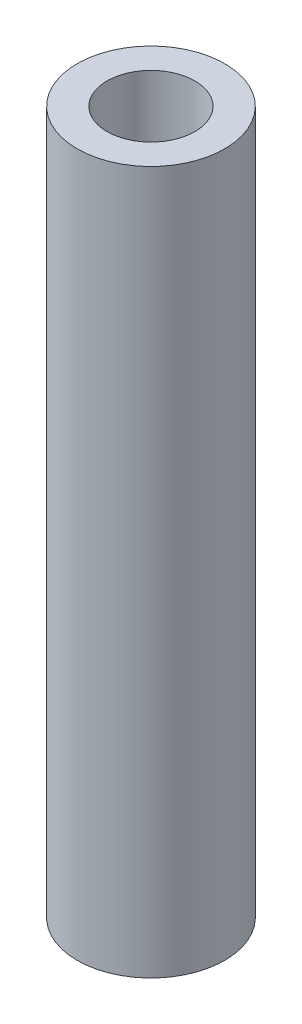
ISO-10303-21;
HEADER;
FILE_DESCRIPTION(('STEP AP214'),'2;1');
FILE_NAME('part.step','',(''),(''),'','','');
FILE_SCHEMA(('AUTOMOTIVE_DESIGN { 1 0 10303 214 1 1 1 1 }'));
ENDSEC;
DATA;
#1=APPLICATION_CONTEXT('core data for automotive mechanical design processes');
#2=APPLICATION_PROTOCOL_DEFINITION('international standard','automotive_design',2000,#1);
#3=PRODUCT_CONTEXT('',#1,'mechanical');
#4=PRODUCT('Part','Part','',(#3));
#5=PRODUCT_RELATED_PRODUCT_CATEGORY('part','',(#4));
#6=PRODUCT_DEFINITION_FORMATION('','',#4);
#7=PRODUCT_DEFINITION_CONTEXT('part definition',#1,'design');
#8=PRODUCT_DEFINITION('design','',#6,#7);
#9=PRODUCT_DEFINITION_SHAPE('','',#8);
#10=(LENGTH_UNIT() NAMED_UNIT(*) SI_UNIT(.MILLI.,.METRE.));
#11=(NAMED_UNIT(*) PLANE_ANGLE_UNIT() SI_UNIT($,.RADIAN.));
#12=(NAMED_UNIT(*) SI_UNIT($,.STERADIAN.) SOLID_ANGLE_UNIT());
#13=UNCERTAINTY_MEASURE_WITH_UNIT(LENGTH_MEASURE(1.E-05),#10,'distance_accuracy_value','');
#14=(GEOMETRIC_REPRESENTATION_CONTEXT(3) GLOBAL_UNCERTAINTY_ASSIGNED_CONTEXT((#13)) GLOBAL_UNIT_ASSIGNED_CONTEXT((#10,
#11,#12)) REPRESENTATION_CONTEXT('',''));
#15=CARTESIAN_POINT('',(0.,0.,0.));
#16=DIRECTION('',(0.,0.,1.));
#17=DIRECTION('',(1.,0.,0.));
#18=AXIS2_PLACEMENT_3D('',#15,#16,#17);
#19=CARTESIAN_POINT('',(0.,101.6,0.));
#20=DIRECTION('',(0.,1.,0.));
#21=DIRECTION('',(0.,0.,1.));
#22=AXIS2_PLACEMENT_3D('',#19,#20,#21);
#23=PLANE('',#22);
#24=CARTESIAN_POINT('',(0.,101.6,0.));
#25=DIRECTION('',(0.,1.,0.));
#26=DIRECTION('',(0.,0.,1.));
#27=AXIS2_PLACEMENT_3D('',#24,#25,#26);
#28=CIRCLE('',#27,10.668);
#29=CARTESIAN_POINT('',(0.,101.6,10.668));
#30=VERTEX_POINT('',#29);
#31=EDGE_CURVE('E10',#30,#30,#28,.T.);
#32=ORIENTED_EDGE('',*,*,#31,.T.);
#33=EDGE_LOOP('',(#32));
#34=FACE_BOUND('',#33,.T.);
#35=CARTESIAN_POINT('',(0.,101.6,0.));
#36=DIRECTION('',(0.,1.,0.));
#37=DIRECTION('',(0.,0.,1.));
#38=AXIS2_PLACEMENT_3D('',#35,#36,#37);
#39=CIRCLE('',#38,6.34999999999999);
#40=CARTESIAN_POINT('',(0.,101.6,6.34999999999999));
#41=VERTEX_POINT('',#40);
#42=EDGE_CURVE('E42',#41,#41,#39,.T.);
#43=ORIENTED_EDGE('',*,*,#42,.F.);
#44=EDGE_LOOP('',(#43));
#45=FACE_BOUND('',#44,.T.);
#46=ADVANCED_FACE('F31',(#34,#45),#23,.T.);
#47=CARTESIAN_POINT('',(0.,0.,0.));
#48=DIRECTION('',(0.,1.,0.));
#49=DIRECTION('',(0.,0.,1.));
#50=AXIS2_PLACEMENT_3D('',#47,#48,#49);
#51=PLANE('',#50);
#52=CARTESIAN_POINT('',(0.,0.,0.));
#53=DIRECTION('',(0.,1.,0.));
#54=DIRECTION('',(0.,0.,1.));
#55=AXIS2_PLACEMENT_3D('',#52,#53,#54);
#56=CIRCLE('',#55,10.668);
#57=CARTESIAN_POINT('',(0.,0.,10.668));
#58=VERTEX_POINT('',#57);
#59=EDGE_CURVE('E35',#58,#58,#56,.T.);
#60=ORIENTED_EDGE('',*,*,#59,.F.);
#61=EDGE_LOOP('',(#60));
#62=FACE_BOUND('',#61,.T.);
#63=CARTESIAN_POINT('',(0.,0.,0.));
#64=DIRECTION('',(0.,1.,0.));
#65=DIRECTION('',(0.,0.,1.));
#66=AXIS2_PLACEMENT_3D('',#63,#64,#65);
#67=CIRCLE('',#66,6.34999999999999);
#68=CARTESIAN_POINT('',(0.,0.,6.34999999999999));
#69=VERTEX_POINT('',#68);
#70=EDGE_CURVE('E44',#69,#69,#67,.T.);
#71=ORIENTED_EDGE('',*,*,#70,.T.);
#72=EDGE_LOOP('',(#71));
#73=FACE_BOUND('',#72,.T.);
#74=ADVANCED_FACE('F54',(#62,#73),#51,.F.);
#75=CARTESIAN_POINT('',(0.,101.6,0.));
#76=DIRECTION('',(0.,-1.,0.));
#77=DIRECTION('',(0.,0.,-1.));
#78=AXIS2_PLACEMENT_3D('',#75,#76,#77);
#79=CYLINDRICAL_SURFACE('',#78,10.668);
#80=ORIENTED_EDGE('',*,*,#31,.F.);
#81=EDGE_LOOP('',(#80));
#82=FACE_BOUND('',#81,.T.);
#83=ORIENTED_EDGE('',*,*,#59,.T.);
#84=EDGE_LOOP('',(#83));
#85=FACE_BOUND('',#84,.T.);
#86=ADVANCED_FACE('F33',(#82,#85),#79,.T.);
#87=CARTESIAN_POINT('',(0.,101.6,0.));
#88=DIRECTION('',(0.,-1.,0.));
#89=DIRECTION('',(0.,0.,-1.));
#90=AXIS2_PLACEMENT_3D('',#87,#88,#89);
#91=CYLINDRICAL_SURFACE('',#90,6.34999999999999);
#92=ORIENTED_EDGE('',*,*,#42,.T.);
#93=EDGE_LOOP('',(#92));
#94=FACE_BOUND('',#93,.T.);
#95=ORIENTED_EDGE('',*,*,#70,.F.);
#96=EDGE_LOOP('',(#95));
#97=FACE_BOUND('',#96,.T.);
#98=ADVANCED_FACE('F50',(#94,#97),#91,.F.);
#99=CLOSED_SHELL('',(#46,#74,#86,#98));
#100=MANIFOLD_SOLID_BREP('B2',#99);
#101=ADVANCED_BREP_SHAPE_REPRESENTATION('',(#18,#100),#14);
#102=SHAPE_DEFINITION_REPRESENTATION(#9,#101);
ENDSEC;
END-ISO-10303-21;
